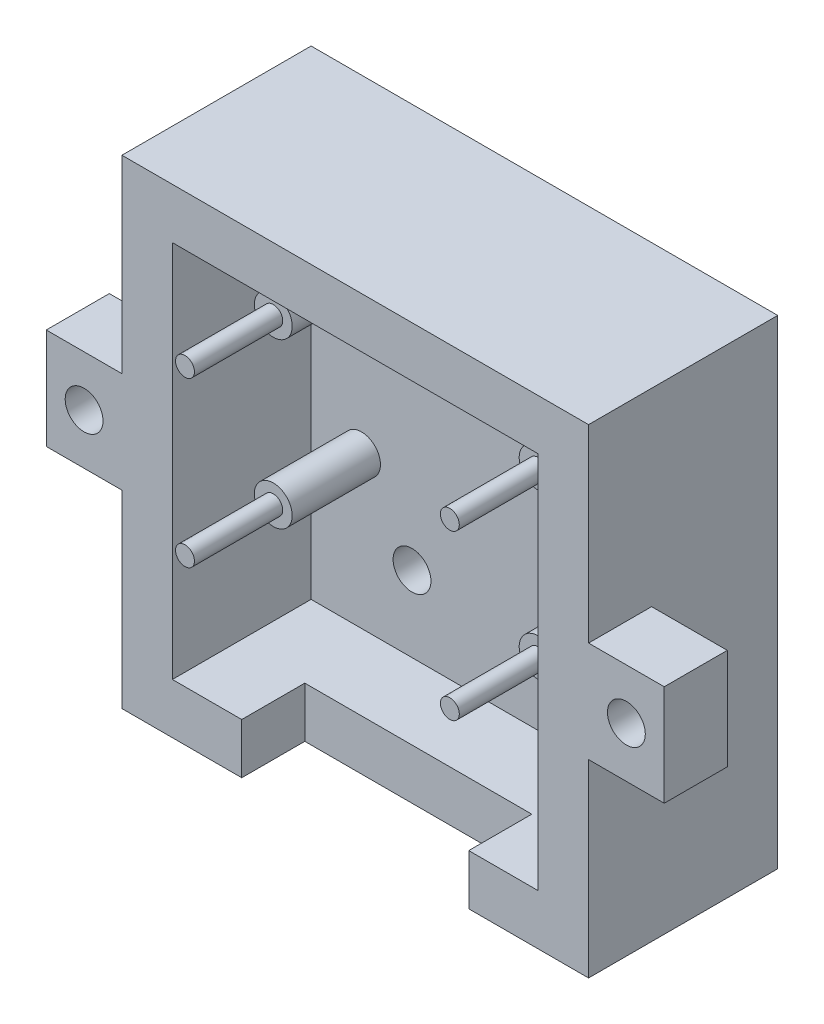
ISO-10303-21;
HEADER;
FILE_DESCRIPTION(('STEP AP214'),'2;1');
FILE_NAME('part.step','',(''),(''),'','','');
FILE_SCHEMA(('AUTOMOTIVE_DESIGN { 1 0 10303 214 1 1 1 1 }'));
ENDSEC;
DATA;
#1=APPLICATION_CONTEXT('core data for automotive mechanical design processes');
#2=APPLICATION_PROTOCOL_DEFINITION('international standard','automotive_design',2000,#1);
#3=PRODUCT_CONTEXT('',#1,'mechanical');
#4=PRODUCT('Part','Part','',(#3));
#5=PRODUCT_RELATED_PRODUCT_CATEGORY('part','',(#4));
#6=PRODUCT_DEFINITION_FORMATION('','',#4);
#7=PRODUCT_DEFINITION_CONTEXT('part definition',#1,'design');
#8=PRODUCT_DEFINITION('design','',#6,#7);
#9=PRODUCT_DEFINITION_SHAPE('','',#8);
#10=(LENGTH_UNIT() NAMED_UNIT(*) SI_UNIT(.MILLI.,.METRE.));
#11=(NAMED_UNIT(*) PLANE_ANGLE_UNIT() SI_UNIT($,.RADIAN.));
#12=(NAMED_UNIT(*) SI_UNIT($,.STERADIAN.) SOLID_ANGLE_UNIT());
#13=UNCERTAINTY_MEASURE_WITH_UNIT(LENGTH_MEASURE(1.E-05),#10,'distance_accuracy_value','');
#14=(GEOMETRIC_REPRESENTATION_CONTEXT(3) GLOBAL_UNCERTAINTY_ASSIGNED_CONTEXT((#13)) GLOBAL_UNIT_ASSIGNED_CONTEXT((#10,
#11,#12)) REPRESENTATION_CONTEXT('',''));
#15=CARTESIAN_POINT('',(0.,0.,0.));
#16=DIRECTION('',(0.,0.,1.));
#17=DIRECTION('',(1.,0.,0.));
#18=AXIS2_PLACEMENT_3D('',#15,#16,#17);
#19=CARTESIAN_POINT('',(-18.5,19.,15.));
#20=DIRECTION('',(1.,0.,0.));
#21=DIRECTION('',(0.,0.,-1.));
#22=AXIS2_PLACEMENT_3D('',#19,#20,#21);
#23=PLANE('',#22);
#24=DIRECTION('',(0.,0.,1.));
#25=VECTOR('',#24,1.);
#26=CARTESIAN_POINT('',(-18.5,-4.,10.));
#27=LINE('',#26,#25);
#28=CARTESIAN_POINT('',(-18.5,-4.,10.));
#29=VERTEX_POINT('',#28);
#30=CARTESIAN_POINT('',(-18.5,-4.,15.));
#31=VERTEX_POINT('',#30);
#32=EDGE_CURVE('E231',#29,#31,#27,.T.);
#33=ORIENTED_EDGE('',*,*,#32,.F.);
#34=DIRECTION('',(0.,1.,0.));
#35=VECTOR('',#34,1.);
#36=CARTESIAN_POINT('',(-18.5,0.,10.));
#37=LINE('',#36,#35);
#38=CARTESIAN_POINT('',(-18.5,4.,10.));
#39=VERTEX_POINT('',#38);
#40=EDGE_CURVE('E222',#29,#39,#37,.T.);
#41=ORIENTED_EDGE('',*,*,#40,.T.);
#42=DIRECTION('',(0.,0.,1.));
#43=VECTOR('',#42,1.);
#44=CARTESIAN_POINT('',(-18.5,4.,10.));
#45=LINE('',#44,#43);
#46=CARTESIAN_POINT('',(-18.5,4.,15.));
#47=VERTEX_POINT('',#46);
#48=EDGE_CURVE('E245',#39,#47,#45,.T.);
#49=ORIENTED_EDGE('',*,*,#48,.T.);
#50=DIRECTION('',(0.,-1.,0.));
#51=VECTOR('',#50,1.);
#52=CARTESIAN_POINT('',(-18.5,19.,15.));
#53=LINE('',#52,#51);
#54=CARTESIAN_POINT('',(-18.5,19.,15.));
#55=VERTEX_POINT('',#54);
#56=EDGE_CURVE('E311',#55,#47,#53,.T.);
#57=ORIENTED_EDGE('',*,*,#56,.F.);
#58=DIRECTION('',(0.,0.,-1.));
#59=VECTOR('',#58,1.);
#60=CARTESIAN_POINT('',(-18.5,19.,15.));
#61=LINE('',#60,#59);
#62=CARTESIAN_POINT('',(-18.5,19.,0.));
#63=VERTEX_POINT('',#62);
#64=EDGE_CURVE('E324',#55,#63,#61,.T.);
#65=ORIENTED_EDGE('',*,*,#64,.T.);
#66=DIRECTION('',(0.,-1.,0.));
#67=VECTOR('',#66,1.);
#68=CARTESIAN_POINT('',(-18.5,19.,0.));
#69=LINE('',#68,#67);
#70=CARTESIAN_POINT('',(-18.5,-19.,0.));
#71=VERTEX_POINT('',#70);
#72=EDGE_CURVE('E285',#63,#71,#69,.T.);
#73=ORIENTED_EDGE('',*,*,#72,.T.);
#74=DIRECTION('',(0.,0.,-1.));
#75=VECTOR('',#74,1.);
#76=CARTESIAN_POINT('',(-18.5,-19.,15.));
#77=LINE('',#76,#75);
#78=CARTESIAN_POINT('',(-18.5,-19.,15.));
#79=VERTEX_POINT('',#78);
#80=EDGE_CURVE('E341',#79,#71,#77,.T.);
#81=ORIENTED_EDGE('',*,*,#80,.F.);
#82=EDGE_CURVE('E315',#31,#79,#53,.T.);
#83=ORIENTED_EDGE('',*,*,#82,.F.);
#84=EDGE_LOOP('',(#33,#41,#49,#57,#65,#73,#81,#83));
#85=FACE_BOUND('',#84,.T.);
#86=ADVANCED_FACE('F45',(#85),#23,.F.);
#87=CARTESIAN_POINT('',(18.5,19.,15.));
#88=DIRECTION('',(-1.,0.,0.));
#89=DIRECTION('',(0.,0.,1.));
#90=AXIS2_PLACEMENT_3D('',#87,#88,#89);
#91=PLANE('',#90);
#92=DIRECTION('',(0.,0.,1.));
#93=VECTOR('',#92,1.);
#94=CARTESIAN_POINT('',(18.5,4.,10.));
#95=LINE('',#94,#93);
#96=CARTESIAN_POINT('',(18.5,4.,10.));
#97=VERTEX_POINT('',#96);
#98=CARTESIAN_POINT('',(18.5,4.,15.));
#99=VERTEX_POINT('',#98);
#100=EDGE_CURVE('E272',#97,#99,#95,.T.);
#101=ORIENTED_EDGE('',*,*,#100,.F.);
#102=DIRECTION('',(0.,1.,0.));
#103=VECTOR('',#102,1.);
#104=CARTESIAN_POINT('',(18.5,0.,10.));
#105=LINE('',#104,#103);
#106=CARTESIAN_POINT('',(18.5,-4.,10.));
#107=VERTEX_POINT('',#106);
#108=EDGE_CURVE('E258',#107,#97,#105,.T.);
#109=ORIENTED_EDGE('',*,*,#108,.F.);
#110=DIRECTION('',(0.,0.,1.));
#111=VECTOR('',#110,1.);
#112=CARTESIAN_POINT('',(18.5,-4.,10.));
#113=LINE('',#112,#111);
#114=CARTESIAN_POINT('',(18.5,-4.,15.));
#115=VERTEX_POINT('',#114);
#116=EDGE_CURVE('E268',#107,#115,#113,.T.);
#117=ORIENTED_EDGE('',*,*,#116,.T.);
#118=DIRECTION('',(0.,1.,0.));
#119=VECTOR('',#118,1.);
#120=CARTESIAN_POINT('',(18.5,19.,15.));
#121=LINE('',#120,#119);
#122=CARTESIAN_POINT('',(18.5,-19.,15.));
#123=VERTEX_POINT('',#122);
#124=EDGE_CURVE('E319',#123,#115,#121,.T.);
#125=ORIENTED_EDGE('',*,*,#124,.F.);
#126=DIRECTION('',(0.,0.,-1.));
#127=VECTOR('',#126,1.);
#128=CARTESIAN_POINT('',(18.5,-19.,15.));
#129=LINE('',#128,#127);
#130=CARTESIAN_POINT('',(18.5,-19.,0.));
#131=VERTEX_POINT('',#130);
#132=EDGE_CURVE('E338',#123,#131,#129,.T.);
#133=ORIENTED_EDGE('',*,*,#132,.T.);
#134=DIRECTION('',(0.,1.,0.));
#135=VECTOR('',#134,1.);
#136=CARTESIAN_POINT('',(18.5,19.,0.));
#137=LINE('',#136,#135);
#138=CARTESIAN_POINT('',(18.5,19.,0.));
#139=VERTEX_POINT('',#138);
#140=EDGE_CURVE('E329',#131,#139,#137,.T.);
#141=ORIENTED_EDGE('',*,*,#140,.T.);
#142=DIRECTION('',(0.,0.,-1.));
#143=VECTOR('',#142,1.);
#144=CARTESIAN_POINT('',(18.5,19.,15.));
#145=LINE('',#144,#143);
#146=CARTESIAN_POINT('',(18.5,19.,15.));
#147=VERTEX_POINT('',#146);
#148=EDGE_CURVE('E335',#147,#139,#145,.T.);
#149=ORIENTED_EDGE('',*,*,#148,.F.);
#150=EDGE_CURVE('E318',#99,#147,#121,.T.);
#151=ORIENTED_EDGE('',*,*,#150,.F.);
#152=EDGE_LOOP('',(#101,#109,#117,#125,#133,#141,#149,#151));
#153=FACE_BOUND('',#152,.T.);
#154=ADVANCED_FACE('F420',(#153),#91,.F.);
#155=CARTESIAN_POINT('',(-18.5,-19.,15.));
#156=DIRECTION('',(0.,1.,0.));
#157=DIRECTION('',(0.,0.,1.));
#158=AXIS2_PLACEMENT_3D('',#155,#156,#157);
#159=PLANE('',#158);
#160=DIRECTION('',(1.,0.,0.));
#161=VECTOR('',#160,1.);
#162=CARTESIAN_POINT('',(-9.,-19.,10.));
#163=LINE('',#162,#161);
#164=CARTESIAN_POINT('',(-9.,-19.,10.));
#165=VERTEX_POINT('',#164);
#166=CARTESIAN_POINT('',(9.,-19.,10.));
#167=VERTEX_POINT('',#166);
#168=EDGE_CURVE('E185',#165,#167,#163,.T.);
#169=ORIENTED_EDGE('',*,*,#168,.F.);
#170=DIRECTION('',(0.,0.,-1.));
#171=VECTOR('',#170,1.);
#172=CARTESIAN_POINT('',(-9.,-19.,15.));
#173=LINE('',#172,#171);
#174=CARTESIAN_POINT('',(-9.,-19.,15.));
#175=VERTEX_POINT('',#174);
#176=EDGE_CURVE('E194',#175,#165,#173,.T.);
#177=ORIENTED_EDGE('',*,*,#176,.F.);
#178=DIRECTION('',(1.,0.,0.));
#179=VECTOR('',#178,1.);
#180=CARTESIAN_POINT('',(-18.5,-19.,15.));
#181=LINE('',#180,#179);
#182=EDGE_CURVE('E316',#79,#175,#181,.T.);
#183=ORIENTED_EDGE('',*,*,#182,.F.);
#184=ORIENTED_EDGE('',*,*,#80,.T.);
#185=DIRECTION('',(1.,0.,0.));
#186=VECTOR('',#185,1.);
#187=CARTESIAN_POINT('',(-18.5,-19.,0.));
#188=LINE('',#187,#186);
#189=EDGE_CURVE('E327',#71,#131,#188,.T.);
#190=ORIENTED_EDGE('',*,*,#189,.T.);
#191=ORIENTED_EDGE('',*,*,#132,.F.);
#192=CARTESIAN_POINT('',(9.,-19.,15.));
#193=VERTEX_POINT('',#192);
#194=EDGE_CURVE('E314',#193,#123,#181,.T.);
#195=ORIENTED_EDGE('',*,*,#194,.F.);
#196=DIRECTION('',(0.,0.,1.));
#197=VECTOR('',#196,1.);
#198=CARTESIAN_POINT('',(9.,-19.,15.));
#199=LINE('',#198,#197);
#200=EDGE_CURVE('E191',#167,#193,#199,.T.);
#201=ORIENTED_EDGE('',*,*,#200,.F.);
#202=EDGE_LOOP('',(#169,#177,#183,#184,#190,#191,#195,#201));
#203=FACE_BOUND('',#202,.T.);
#204=ADVANCED_FACE('F203',(#203),#159,.F.);
#205=CARTESIAN_POINT('',(-18.5,19.,15.));
#206=DIRECTION('',(0.,-1.,0.));
#207=DIRECTION('',(0.,0.,-1.));
#208=AXIS2_PLACEMENT_3D('',#205,#206,#207);
#209=PLANE('',#208);
#210=DIRECTION('',(-1.,0.,0.));
#211=VECTOR('',#210,1.);
#212=CARTESIAN_POINT('',(-18.5,19.,0.));
#213=LINE('',#212,#211);
#214=EDGE_CURVE('E331',#139,#63,#213,.T.);
#215=ORIENTED_EDGE('',*,*,#214,.T.);
#216=ORIENTED_EDGE('',*,*,#64,.F.);
#217=DIRECTION('',(-1.,0.,0.));
#218=VECTOR('',#217,1.);
#219=CARTESIAN_POINT('',(-18.5,19.,15.));
#220=LINE('',#219,#218);
#221=EDGE_CURVE('E322',#147,#55,#220,.T.);
#222=ORIENTED_EDGE('',*,*,#221,.F.);
#223=ORIENTED_EDGE('',*,*,#148,.T.);
#224=EDGE_LOOP('',(#215,#216,#222,#223));
#225=FACE_BOUND('',#224,.T.);
#226=ADVANCED_FACE('F451',(#225),#209,.F.);
#227=CARTESIAN_POINT('',(0.,0.,15.));
#228=DIRECTION('',(0.,0.,1.));
#229=DIRECTION('',(1.,0.,0.));
#230=AXIS2_PLACEMENT_3D('',#227,#228,#229);
#231=PLANE('',#230);
#232=DIRECTION('',(0.,-1.,0.));
#233=VECTOR('',#232,1.);
#234=CARTESIAN_POINT('',(-9.,-14.,15.));
#235=LINE('',#234,#233);
#236=CARTESIAN_POINT('',(-9.,-15.,15.));
#237=VERTEX_POINT('',#236);
#238=EDGE_CURVE('E197',#237,#175,#235,.T.);
#239=ORIENTED_EDGE('',*,*,#238,.F.);
#240=DIRECTION('',(1.,0.,0.));
#241=VECTOR('',#240,1.);
#242=CARTESIAN_POINT('',(-18.5,-15.,15.));
#243=LINE('',#242,#241);
#244=CARTESIAN_POINT('',(-14.5,-15.,15.));
#245=VERTEX_POINT('',#244);
#246=EDGE_CURVE('E304',#245,#237,#243,.T.);
#247=ORIENTED_EDGE('',*,*,#246,.F.);
#248=DIRECTION('',(0.,-1.,0.));
#249=VECTOR('',#248,1.);
#250=CARTESIAN_POINT('',(-14.5,19.,15.));
#251=LINE('',#250,#249);
#252=CARTESIAN_POINT('',(-14.5,15.,15.));
#253=VERTEX_POINT('',#252);
#254=EDGE_CURVE('E301',#253,#245,#251,.T.);
#255=ORIENTED_EDGE('',*,*,#254,.F.);
#256=DIRECTION('',(-1.,0.,0.));
#257=VECTOR('',#256,1.);
#258=CARTESIAN_POINT('',(-18.5,15.,15.));
#259=LINE('',#258,#257);
#260=CARTESIAN_POINT('',(14.5,15.,15.));
#261=VERTEX_POINT('',#260);
#262=EDGE_CURVE('E291',#261,#253,#259,.T.);
#263=ORIENTED_EDGE('',*,*,#262,.F.);
#264=DIRECTION('',(0.,1.,0.));
#265=VECTOR('',#264,1.);
#266=CARTESIAN_POINT('',(14.5,19.,15.));
#267=LINE('',#266,#265);
#268=CARTESIAN_POINT('',(14.5,-15.,15.));
#269=VERTEX_POINT('',#268);
#270=EDGE_CURVE('E307',#269,#261,#267,.T.);
#271=ORIENTED_EDGE('',*,*,#270,.F.);
#272=CARTESIAN_POINT('',(9.,-15.,15.));
#273=VERTEX_POINT('',#272);
#274=EDGE_CURVE('E303',#273,#269,#243,.T.);
#275=ORIENTED_EDGE('',*,*,#274,.F.);
#276=DIRECTION('',(0.,-1.,0.));
#277=VECTOR('',#276,1.);
#278=CARTESIAN_POINT('',(9.,-14.,15.));
#279=LINE('',#278,#277);
#280=EDGE_CURVE('E211',#273,#193,#279,.T.);
#281=ORIENTED_EDGE('',*,*,#280,.T.);
#282=ORIENTED_EDGE('',*,*,#194,.T.);
#283=ORIENTED_EDGE('',*,*,#124,.T.);
#284=DIRECTION('',(-1.,0.,0.));
#285=VECTOR('',#284,1.);
#286=CARTESIAN_POINT('',(0.,-4.,15.));
#287=LINE('',#286,#285);
#288=CARTESIAN_POINT('',(24.5,-4.,15.));
#289=VERTEX_POINT('',#288);
#290=EDGE_CURVE('E263',#289,#115,#287,.T.);
#291=ORIENTED_EDGE('',*,*,#290,.F.);
#292=DIRECTION('',(0.,-1.,0.));
#293=VECTOR('',#292,1.);
#294=CARTESIAN_POINT('',(24.5,0.,15.));
#295=LINE('',#294,#293);
#296=CARTESIAN_POINT('',(24.5,4.,15.));
#297=VERTEX_POINT('',#296);
#298=EDGE_CURVE('E265',#297,#289,#295,.T.);
#299=ORIENTED_EDGE('',*,*,#298,.F.);
#300=DIRECTION('',(1.,0.,0.));
#301=VECTOR('',#300,1.);
#302=CARTESIAN_POINT('',(0.,4.,15.));
#303=LINE('',#302,#301);
#304=EDGE_CURVE('E252',#99,#297,#303,.T.);
#305=ORIENTED_EDGE('',*,*,#304,.F.);
#306=ORIENTED_EDGE('',*,*,#150,.T.);
#307=ORIENTED_EDGE('',*,*,#221,.T.);
#308=ORIENTED_EDGE('',*,*,#56,.T.);
#309=DIRECTION('',(-1.,0.,0.));
#310=VECTOR('',#309,1.);
#311=CARTESIAN_POINT('',(0.,4.,15.));
#312=LINE('',#311,#310);
#313=CARTESIAN_POINT('',(-24.5,4.,15.));
#314=VERTEX_POINT('',#313);
#315=EDGE_CURVE('E69',#47,#314,#312,.T.);
#316=ORIENTED_EDGE('',*,*,#315,.T.);
#317=DIRECTION('',(0.,-1.,0.));
#318=VECTOR('',#317,1.);
#319=CARTESIAN_POINT('',(-24.5,0.,15.));
#320=LINE('',#319,#318);
#321=CARTESIAN_POINT('',(-24.5,-4.,15.));
#322=VERTEX_POINT('',#321);
#323=EDGE_CURVE('E219',#314,#322,#320,.T.);
#324=ORIENTED_EDGE('',*,*,#323,.T.);
#325=DIRECTION('',(1.,0.,0.));
#326=VECTOR('',#325,1.);
#327=CARTESIAN_POINT('',(0.,-4.,15.));
#328=LINE('',#327,#326);
#329=EDGE_CURVE('E234',#322,#31,#328,.T.);
#330=ORIENTED_EDGE('',*,*,#329,.T.);
#331=ORIENTED_EDGE('',*,*,#82,.T.);
#332=ORIENTED_EDGE('',*,*,#182,.T.);
#333=EDGE_LOOP('',(#239,#247,#255,#263,#271,#275,#281,#282,#283,#291,#299,#305,#306,#307,#308,
#316,#324,#330,#331,#332));
#334=FACE_BOUND('',#333,.T.);
#335=CARTESIAN_POINT('',(21.5,0.,15.));
#336=DIRECTION('',(0.,0.,1.));
#337=DIRECTION('',(1.,0.,0.));
#338=AXIS2_PLACEMENT_3D('',#335,#336,#337);
#339=CIRCLE('',#338,1.5);
#340=CARTESIAN_POINT('',(23.,0.,15.));
#341=VERTEX_POINT('',#340);
#342=EDGE_CURVE('E242',#341,#341,#339,.T.);
#343=ORIENTED_EDGE('',*,*,#342,.F.);
#344=EDGE_LOOP('',(#343));
#345=FACE_BOUND('',#344,.T.);
#346=CARTESIAN_POINT('',(-21.5,0.,15.));
#347=DIRECTION('',(0.,0.,-1.));
#348=DIRECTION('',(-1.,0.,0.));
#349=AXIS2_PLACEMENT_3D('',#346,#347,#348);
#350=CIRCLE('',#349,1.5);
#351=CARTESIAN_POINT('',(-23.,0.,15.));
#352=VERTEX_POINT('',#351);
#353=EDGE_CURVE('E210',#352,#352,#350,.T.);
#354=ORIENTED_EDGE('',*,*,#353,.T.);
#355=EDGE_LOOP('',(#354));
#356=FACE_BOUND('',#355,.T.);
#357=ADVANCED_FACE('F402',(#334,#345,#356),#231,.T.);
#358=CARTESIAN_POINT('',(0.,0.,0.));
#359=DIRECTION('',(0.,0.,1.));
#360=DIRECTION('',(1.,0.,0.));
#361=AXIS2_PLACEMENT_3D('',#358,#359,#360);
#362=PLANE('',#361);
#363=CARTESIAN_POINT('',(-6.5,-9.,0.));
#364=DIRECTION('',(0.,0.,1.));
#365=DIRECTION('',(1.,0.,0.));
#366=AXIS2_PLACEMENT_3D('',#363,#364,#365);
#367=CIRCLE('',#366,1.5);
#368=CARTESIAN_POINT('',(-5.,-9.,0.));
#369=VERTEX_POINT('',#368);
#370=EDGE_CURVE('E876',#369,#369,#367,.T.);
#371=ORIENTED_EDGE('',*,*,#370,.T.);
#372=EDGE_LOOP('',(#371));
#373=FACE_BOUND('',#372,.T.);
#374=CARTESIAN_POINT('',(6.5,-9.,0.));
#375=DIRECTION('',(0.,0.,1.));
#376=DIRECTION('',(1.,0.,0.));
#377=AXIS2_PLACEMENT_3D('',#374,#375,#376);
#378=CIRCLE('',#377,1.5);
#379=CARTESIAN_POINT('',(8.,-9.,0.));
#380=VERTEX_POINT('',#379);
#381=EDGE_CURVE('E878',#380,#380,#378,.T.);
#382=ORIENTED_EDGE('',*,*,#381,.T.);
#383=EDGE_LOOP('',(#382));
#384=FACE_BOUND('',#383,.T.);
#385=CARTESIAN_POINT('',(6.5,9.,0.));
#386=DIRECTION('',(0.,0.,1.));
#387=DIRECTION('',(1.,0.,0.));
#388=AXIS2_PLACEMENT_3D('',#385,#386,#387);
#389=CIRCLE('',#388,1.5);
#390=CARTESIAN_POINT('',(8.,9.,0.));
#391=VERTEX_POINT('',#390);
#392=EDGE_CURVE('E884',#391,#391,#389,.T.);
#393=ORIENTED_EDGE('',*,*,#392,.T.);
#394=EDGE_LOOP('',(#393));
#395=FACE_BOUND('',#394,.T.);
#396=CARTESIAN_POINT('',(-6.5,9.,0.));
#397=DIRECTION('',(0.,0.,1.));
#398=DIRECTION('',(1.,0.,0.));
#399=AXIS2_PLACEMENT_3D('',#396,#397,#398);
#400=CIRCLE('',#399,1.5);
#401=CARTESIAN_POINT('',(-5.,9.,0.));
#402=VERTEX_POINT('',#401);
#403=EDGE_CURVE('E913',#402,#402,#400,.T.);
#404=ORIENTED_EDGE('',*,*,#403,.T.);
#405=EDGE_LOOP('',(#404));
#406=FACE_BOUND('',#405,.T.);
#407=ORIENTED_EDGE('',*,*,#72,.F.);
#408=ORIENTED_EDGE('',*,*,#214,.F.);
#409=ORIENTED_EDGE('',*,*,#140,.F.);
#410=ORIENTED_EDGE('',*,*,#189,.F.);
#411=EDGE_LOOP('',(#407,#408,#409,#410));
#412=FACE_BOUND('',#411,.T.);
#413=ADVANCED_FACE('F414',(#373,#384,#395,#406,#412),#362,.F.);
#414=CARTESIAN_POINT('',(-14.5,19.,15.));
#415=DIRECTION('',(1.,0.,0.));
#416=DIRECTION('',(0.,0.,-1.));
#417=AXIS2_PLACEMENT_3D('',#414,#415,#416);
#418=PLANE('',#417);
#419=DIRECTION('',(0.,-1.,0.));
#420=VECTOR('',#419,1.);
#421=CARTESIAN_POINT('',(-14.5,19.,4.));
#422=LINE('',#421,#420);
#423=CARTESIAN_POINT('',(-14.5,15.,4.));
#424=VERTEX_POINT('',#423);
#425=CARTESIAN_POINT('',(-14.5,-15.,4.));
#426=VERTEX_POINT('',#425);
#427=EDGE_CURVE('E271',#424,#426,#422,.T.);
#428=ORIENTED_EDGE('',*,*,#427,.F.);
#429=DIRECTION('',(0.,0.,-1.));
#430=VECTOR('',#429,1.);
#431=CARTESIAN_POINT('',(-14.5,15.,15.));
#432=LINE('',#431,#430);
#433=EDGE_CURVE('E287',#253,#424,#432,.T.);
#434=ORIENTED_EDGE('',*,*,#433,.F.);
#435=ORIENTED_EDGE('',*,*,#254,.T.);
#436=DIRECTION('',(0.,0.,-1.));
#437=VECTOR('',#436,1.);
#438=CARTESIAN_POINT('',(-14.5,-15.,15.));
#439=LINE('',#438,#437);
#440=EDGE_CURVE('E282',#245,#426,#439,.T.);
#441=ORIENTED_EDGE('',*,*,#440,.T.);
#442=EDGE_LOOP('',(#428,#434,#435,#441));
#443=FACE_BOUND('',#442,.T.);
#444=ADVANCED_FACE('F395',(#443),#418,.T.);
#445=CARTESIAN_POINT('',(-18.5,-15.,15.));
#446=DIRECTION('',(0.,1.,0.));
#447=DIRECTION('',(0.,0.,1.));
#448=AXIS2_PLACEMENT_3D('',#445,#446,#447);
#449=PLANE('',#448);
#450=DIRECTION('',(0.,0.,1.));
#451=VECTOR('',#450,1.);
#452=CARTESIAN_POINT('',(-9.,-15.,15.));
#453=LINE('',#452,#451);
#454=CARTESIAN_POINT('',(-9.,-15.,10.));
#455=VERTEX_POINT('',#454);
#456=EDGE_CURVE('E48',#455,#237,#453,.T.);
#457=ORIENTED_EDGE('',*,*,#456,.F.);
#458=DIRECTION('',(-1.,0.,0.));
#459=VECTOR('',#458,1.);
#460=CARTESIAN_POINT('',(-18.5,-15.,10.));
#461=LINE('',#460,#459);
#462=CARTESIAN_POINT('',(9.,-15.,10.));
#463=VERTEX_POINT('',#462);
#464=EDGE_CURVE('E188',#463,#455,#461,.T.);
#465=ORIENTED_EDGE('',*,*,#464,.F.);
#466=DIRECTION('',(0.,0.,-1.));
#467=VECTOR('',#466,1.);
#468=CARTESIAN_POINT('',(9.,-15.,15.));
#469=LINE('',#468,#467);
#470=EDGE_CURVE('E344',#273,#463,#469,.T.);
#471=ORIENTED_EDGE('',*,*,#470,.F.);
#472=ORIENTED_EDGE('',*,*,#274,.T.);
#473=DIRECTION('',(0.,0.,-1.));
#474=VECTOR('',#473,1.);
#475=CARTESIAN_POINT('',(14.5,-15.,15.));
#476=LINE('',#475,#474);
#477=CARTESIAN_POINT('',(14.5,-15.,4.));
#478=VERTEX_POINT('',#477);
#479=EDGE_CURVE('E286',#269,#478,#476,.T.);
#480=ORIENTED_EDGE('',*,*,#479,.T.);
#481=DIRECTION('',(1.,0.,0.));
#482=VECTOR('',#481,1.);
#483=CARTESIAN_POINT('',(-18.5,-15.,4.));
#484=LINE('',#483,#482);
#485=EDGE_CURVE('E281',#426,#478,#484,.T.);
#486=ORIENTED_EDGE('',*,*,#485,.F.);
#487=ORIENTED_EDGE('',*,*,#440,.F.);
#488=ORIENTED_EDGE('',*,*,#246,.T.);
#489=EDGE_LOOP('',(#457,#465,#471,#472,#480,#486,#487,#488));
#490=FACE_BOUND('',#489,.T.);
#491=ADVANCED_FACE('F400',(#490),#449,.T.);
#492=CARTESIAN_POINT('',(14.5,19.,15.));
#493=DIRECTION('',(-1.,0.,0.));
#494=DIRECTION('',(0.,0.,1.));
#495=AXIS2_PLACEMENT_3D('',#492,#493,#494);
#496=PLANE('',#495);
#497=DIRECTION('',(0.,1.,0.));
#498=VECTOR('',#497,1.);
#499=CARTESIAN_POINT('',(14.5,19.,4.));
#500=LINE('',#499,#498);
#501=CARTESIAN_POINT('',(14.5,15.,4.));
#502=VERTEX_POINT('',#501);
#503=EDGE_CURVE('E293',#478,#502,#500,.T.);
#504=ORIENTED_EDGE('',*,*,#503,.F.);
#505=ORIENTED_EDGE('',*,*,#479,.F.);
#506=ORIENTED_EDGE('',*,*,#270,.T.);
#507=DIRECTION('',(0.,0.,-1.));
#508=VECTOR('',#507,1.);
#509=CARTESIAN_POINT('',(14.5,15.,15.));
#510=LINE('',#509,#508);
#511=EDGE_CURVE('E290',#261,#502,#510,.T.);
#512=ORIENTED_EDGE('',*,*,#511,.T.);
#513=EDGE_LOOP('',(#504,#505,#506,#512));
#514=FACE_BOUND('',#513,.T.);
#515=ADVANCED_FACE('F432',(#514),#496,.T.);
#516=CARTESIAN_POINT('',(-18.5,15.,15.));
#517=DIRECTION('',(0.,-1.,0.));
#518=DIRECTION('',(0.,0.,-1.));
#519=AXIS2_PLACEMENT_3D('',#516,#517,#518);
#520=PLANE('',#519);
#521=DIRECTION('',(-1.,0.,0.));
#522=VECTOR('',#521,1.);
#523=CARTESIAN_POINT('',(-18.5,15.,4.));
#524=LINE('',#523,#522);
#525=EDGE_CURVE('E297',#502,#424,#524,.T.);
#526=ORIENTED_EDGE('',*,*,#525,.F.);
#527=ORIENTED_EDGE('',*,*,#511,.F.);
#528=ORIENTED_EDGE('',*,*,#262,.T.);
#529=ORIENTED_EDGE('',*,*,#433,.T.);
#530=EDGE_LOOP('',(#526,#527,#528,#529));
#531=FACE_BOUND('',#530,.T.);
#532=ADVANCED_FACE('F388',(#531),#520,.T.);
#533=CARTESIAN_POINT('',(0.,0.,4.));
#534=DIRECTION('',(0.,0.,1.));
#535=DIRECTION('',(1.,0.,0.));
#536=AXIS2_PLACEMENT_3D('',#533,#534,#535);
#537=PLANE('',#536);
#538=CARTESIAN_POINT('',(-6.5,-9.,4.));
#539=DIRECTION('',(0.,0.,1.));
#540=DIRECTION('',(1.,0.,0.));
#541=AXIS2_PLACEMENT_3D('',#538,#539,#540);
#542=CIRCLE('',#541,1.5);
#543=CARTESIAN_POINT('',(-5.,-9.,4.));
#544=VERTEX_POINT('',#543);
#545=EDGE_CURVE('E873',#544,#544,#542,.T.);
#546=ORIENTED_EDGE('',*,*,#545,.F.);
#547=EDGE_LOOP('',(#546));
#548=FACE_BOUND('',#547,.T.);
#549=CARTESIAN_POINT('',(6.5,-9.,4.));
#550=DIRECTION('',(0.,0.,1.));
#551=DIRECTION('',(1.,0.,0.));
#552=AXIS2_PLACEMENT_3D('',#549,#550,#551);
#553=CIRCLE('',#552,1.5);
#554=CARTESIAN_POINT('',(8.,-9.,4.));
#555=VERTEX_POINT('',#554);
#556=EDGE_CURVE('E921',#555,#555,#553,.T.);
#557=ORIENTED_EDGE('',*,*,#556,.F.);
#558=EDGE_LOOP('',(#557));
#559=FACE_BOUND('',#558,.T.);
#560=CARTESIAN_POINT('',(6.5,9.,4.));
#561=DIRECTION('',(0.,0.,1.));
#562=DIRECTION('',(1.,0.,0.));
#563=AXIS2_PLACEMENT_3D('',#560,#561,#562);
#564=CIRCLE('',#563,1.5);
#565=CARTESIAN_POINT('',(8.,9.,4.));
#566=VERTEX_POINT('',#565);
#567=EDGE_CURVE('E919',#566,#566,#564,.T.);
#568=ORIENTED_EDGE('',*,*,#567,.F.);
#569=EDGE_LOOP('',(#568));
#570=FACE_BOUND('',#569,.T.);
#571=CARTESIAN_POINT('',(-6.5,9.,4.));
#572=DIRECTION('',(0.,0.,1.));
#573=DIRECTION('',(1.,0.,0.));
#574=AXIS2_PLACEMENT_3D('',#571,#572,#573);
#575=CIRCLE('',#574,1.5);
#576=CARTESIAN_POINT('',(-5.,9.,4.));
#577=VERTEX_POINT('',#576);
#578=EDGE_CURVE('E916',#577,#577,#575,.T.);
#579=ORIENTED_EDGE('',*,*,#578,.F.);
#580=EDGE_LOOP('',(#579));
#581=FACE_BOUND('',#580,.T.);
#582=CARTESIAN_POINT('',(-10.5,-2.99999999999999,4.));
#583=DIRECTION('',(0.,0.,1.));
#584=DIRECTION('',(1.,0.,0.));
#585=AXIS2_PLACEMENT_3D('',#582,#583,#584);
#586=CIRCLE('',#585,1.5);
#587=CARTESIAN_POINT('',(-9.,-2.99999999999999,4.));
#588=VERTEX_POINT('',#587);
#589=EDGE_CURVE('E359',#588,#588,#586,.T.);
#590=ORIENTED_EDGE('',*,*,#589,.F.);
#591=EDGE_LOOP('',(#590));
#592=FACE_BOUND('',#591,.T.);
#593=CARTESIAN_POINT('',(10.5,-2.99999999999999,4.));
#594=DIRECTION('',(0.,0.,1.));
#595=DIRECTION('',(1.,0.,0.));
#596=AXIS2_PLACEMENT_3D('',#593,#594,#595);
#597=CIRCLE('',#596,1.5);
#598=CARTESIAN_POINT('',(12.,-2.99999999999999,4.));
#599=VERTEX_POINT('',#598);
#600=EDGE_CURVE('E366',#599,#599,#597,.T.);
#601=ORIENTED_EDGE('',*,*,#600,.F.);
#602=EDGE_LOOP('',(#601));
#603=FACE_BOUND('',#602,.T.);
#604=CARTESIAN_POINT('',(10.5,10.,4.));
#605=DIRECTION('',(0.,0.,1.));
#606=DIRECTION('',(1.,0.,0.));
#607=AXIS2_PLACEMENT_3D('',#604,#605,#606);
#608=CIRCLE('',#607,1.5);
#609=CARTESIAN_POINT('',(12.,10.,4.));
#610=VERTEX_POINT('',#609);
#611=EDGE_CURVE('E372',#610,#610,#608,.T.);
#612=ORIENTED_EDGE('',*,*,#611,.F.);
#613=EDGE_LOOP('',(#612));
#614=FACE_BOUND('',#613,.T.);
#615=CARTESIAN_POINT('',(-10.5,10.,4.));
#616=DIRECTION('',(0.,0.,1.));
#617=DIRECTION('',(1.,0.,0.));
#618=AXIS2_PLACEMENT_3D('',#615,#616,#617);
#619=CIRCLE('',#618,1.5);
#620=CARTESIAN_POINT('',(-9.,10.,4.));
#621=VERTEX_POINT('',#620);
#622=EDGE_CURVE('E375',#621,#621,#619,.T.);
#623=ORIENTED_EDGE('',*,*,#622,.F.);
#624=EDGE_LOOP('',(#623));
#625=FACE_BOUND('',#624,.T.);
#626=ORIENTED_EDGE('',*,*,#427,.T.);
#627=ORIENTED_EDGE('',*,*,#485,.T.);
#628=ORIENTED_EDGE('',*,*,#503,.T.);
#629=ORIENTED_EDGE('',*,*,#525,.T.);
#630=EDGE_LOOP('',(#626,#627,#628,#629));
#631=FACE_BOUND('',#630,.T.);
#632=ADVANCED_FACE('F384',(#548,#559,#570,#581,#592,#603,#614,#625,#631),#537,.T.);
#633=CARTESIAN_POINT('',(0.,-4.,10.));
#634=DIRECTION('',(0.,1.,0.));
#635=DIRECTION('',(0.,0.,1.));
#636=AXIS2_PLACEMENT_3D('',#633,#634,#635);
#637=PLANE('',#636);
#638=ORIENTED_EDGE('',*,*,#290,.T.);
#639=ORIENTED_EDGE('',*,*,#116,.F.);
#640=DIRECTION('',(-1.,0.,0.));
#641=VECTOR('',#640,1.);
#642=CARTESIAN_POINT('',(0.,-4.,10.));
#643=LINE('',#642,#641);
#644=CARTESIAN_POINT('',(24.5,-4.,10.));
#645=VERTEX_POINT('',#644);
#646=EDGE_CURVE('E251',#645,#107,#643,.T.);
#647=ORIENTED_EDGE('',*,*,#646,.F.);
#648=DIRECTION('',(0.,0.,1.));
#649=VECTOR('',#648,1.);
#650=CARTESIAN_POINT('',(24.5,-4.,10.));
#651=LINE('',#650,#649);
#652=EDGE_CURVE('E260',#645,#289,#651,.T.);
#653=ORIENTED_EDGE('',*,*,#652,.T.);
#654=EDGE_LOOP('',(#638,#639,#647,#653));
#655=FACE_BOUND('',#654,.T.);
#656=ADVANCED_FACE('F387',(#655),#637,.F.);
#657=CARTESIAN_POINT('',(0.,4.,10.));
#658=DIRECTION('',(0.,-1.,0.));
#659=DIRECTION('',(0.,0.,-1.));
#660=AXIS2_PLACEMENT_3D('',#657,#658,#659);
#661=PLANE('',#660);
#662=ORIENTED_EDGE('',*,*,#304,.T.);
#663=DIRECTION('',(0.,0.,1.));
#664=VECTOR('',#663,1.);
#665=CARTESIAN_POINT('',(24.5,4.,10.));
#666=LINE('',#665,#664);
#667=CARTESIAN_POINT('',(24.5,4.,10.));
#668=VERTEX_POINT('',#667);
#669=EDGE_CURVE('E274',#668,#297,#666,.T.);
#670=ORIENTED_EDGE('',*,*,#669,.F.);
#671=DIRECTION('',(1.,0.,0.));
#672=VECTOR('',#671,1.);
#673=CARTESIAN_POINT('',(0.,4.,10.));
#674=LINE('',#673,#672);
#675=EDGE_CURVE('E256',#97,#668,#674,.T.);
#676=ORIENTED_EDGE('',*,*,#675,.F.);
#677=ORIENTED_EDGE('',*,*,#100,.T.);
#678=EDGE_LOOP('',(#662,#670,#676,#677));
#679=FACE_BOUND('',#678,.T.);
#680=ADVANCED_FACE('F781',(#679),#661,.F.);
#681=CARTESIAN_POINT('',(21.5,0.,10.));
#682=DIRECTION('',(0.,0.,1.));
#683=DIRECTION('',(1.,0.,0.));
#684=AXIS2_PLACEMENT_3D('',#681,#682,#683);
#685=CYLINDRICAL_SURFACE('',#684,1.5);
#686=CARTESIAN_POINT('',(21.5,0.,10.));
#687=DIRECTION('',(0.,0.,1.));
#688=DIRECTION('',(1.,0.,0.));
#689=AXIS2_PLACEMENT_3D('',#686,#687,#688);
#690=CIRCLE('',#689,1.5);
#691=CARTESIAN_POINT('',(23.,0.,10.));
#692=VERTEX_POINT('',#691);
#693=EDGE_CURVE('E248',#692,#692,#690,.T.);
#694=ORIENTED_EDGE('',*,*,#693,.F.);
#695=EDGE_LOOP('',(#694));
#696=FACE_BOUND('',#695,.T.);
#697=ORIENTED_EDGE('',*,*,#342,.T.);
#698=EDGE_LOOP('',(#697));
#699=FACE_BOUND('',#698,.T.);
#700=ADVANCED_FACE('F772',(#696,#699),#685,.F.);
#701=CARTESIAN_POINT('',(24.5,0.,10.));
#702=DIRECTION('',(-1.,0.,0.));
#703=DIRECTION('',(0.,0.,1.));
#704=AXIS2_PLACEMENT_3D('',#701,#702,#703);
#705=PLANE('',#704);
#706=ORIENTED_EDGE('',*,*,#298,.T.);
#707=ORIENTED_EDGE('',*,*,#652,.F.);
#708=DIRECTION('',(0.,-1.,0.));
#709=VECTOR('',#708,1.);
#710=CARTESIAN_POINT('',(24.5,0.,10.));
#711=LINE('',#710,#709);
#712=EDGE_CURVE('E254',#668,#645,#711,.T.);
#713=ORIENTED_EDGE('',*,*,#712,.F.);
#714=ORIENTED_EDGE('',*,*,#669,.T.);
#715=EDGE_LOOP('',(#706,#707,#713,#714));
#716=FACE_BOUND('',#715,.T.);
#717=ADVANCED_FACE('F763',(#716),#705,.F.);
#718=CARTESIAN_POINT('',(0.,0.,10.));
#719=DIRECTION('',(0.,0.,1.));
#720=DIRECTION('',(1.,0.,0.));
#721=AXIS2_PLACEMENT_3D('',#718,#719,#720);
#722=PLANE('',#721);
#723=ORIENTED_EDGE('',*,*,#693,.T.);
#724=EDGE_LOOP('',(#723));
#725=FACE_BOUND('',#724,.T.);
#726=ORIENTED_EDGE('',*,*,#646,.T.);
#727=ORIENTED_EDGE('',*,*,#108,.T.);
#728=ORIENTED_EDGE('',*,*,#675,.T.);
#729=ORIENTED_EDGE('',*,*,#712,.T.);
#730=EDGE_LOOP('',(#726,#727,#728,#729));
#731=FACE_BOUND('',#730,.T.);
#732=ADVANCED_FACE('F751',(#725,#731),#722,.F.);
#733=CARTESIAN_POINT('',(0.,-4.,10.));
#734=DIRECTION('',(0.,-1.,0.));
#735=DIRECTION('',(0.,0.,-1.));
#736=AXIS2_PLACEMENT_3D('',#733,#734,#735);
#737=PLANE('',#736);
#738=ORIENTED_EDGE('',*,*,#329,.F.);
#739=DIRECTION('',(0.,0.,1.));
#740=VECTOR('',#739,1.);
#741=CARTESIAN_POINT('',(-24.5,-4.,10.));
#742=LINE('',#741,#740);
#743=CARTESIAN_POINT('',(-24.5,-4.,10.));
#744=VERTEX_POINT('',#743);
#745=EDGE_CURVE('E240',#744,#322,#742,.T.);
#746=ORIENTED_EDGE('',*,*,#745,.F.);
#747=DIRECTION('',(1.,0.,0.));
#748=VECTOR('',#747,1.);
#749=CARTESIAN_POINT('',(0.,-4.,10.));
#750=LINE('',#749,#748);
#751=EDGE_CURVE('E218',#744,#29,#750,.T.);
#752=ORIENTED_EDGE('',*,*,#751,.T.);
#753=ORIENTED_EDGE('',*,*,#32,.T.);
#754=EDGE_LOOP('',(#738,#746,#752,#753));
#755=FACE_BOUND('',#754,.T.);
#756=ADVANCED_FACE('F745',(#755),#737,.T.);
#757=CARTESIAN_POINT('',(-24.5,0.,10.));
#758=DIRECTION('',(-1.,0.,0.));
#759=DIRECTION('',(0.,0.,1.));
#760=AXIS2_PLACEMENT_3D('',#757,#758,#759);
#761=PLANE('',#760);
#762=ORIENTED_EDGE('',*,*,#323,.F.);
#763=DIRECTION('',(0.,0.,1.));
#764=VECTOR('',#763,1.);
#765=CARTESIAN_POINT('',(-24.5,4.,10.));
#766=LINE('',#765,#764);
#767=CARTESIAN_POINT('',(-24.5,4.,10.));
#768=VERTEX_POINT('',#767);
#769=EDGE_CURVE('E243',#768,#314,#766,.T.);
#770=ORIENTED_EDGE('',*,*,#769,.F.);
#771=DIRECTION('',(0.,-1.,0.));
#772=VECTOR('',#771,1.);
#773=CARTESIAN_POINT('',(-24.5,0.,10.));
#774=LINE('',#773,#772);
#775=EDGE_CURVE('E228',#768,#744,#774,.T.);
#776=ORIENTED_EDGE('',*,*,#775,.T.);
#777=ORIENTED_EDGE('',*,*,#745,.T.);
#778=EDGE_LOOP('',(#762,#770,#776,#777));
#779=FACE_BOUND('',#778,.T.);
#780=ADVANCED_FACE('F737',(#779),#761,.T.);
#781=CARTESIAN_POINT('',(0.,4.,10.));
#782=DIRECTION('',(0.,1.,0.));
#783=DIRECTION('',(0.,0.,1.));
#784=AXIS2_PLACEMENT_3D('',#781,#782,#783);
#785=PLANE('',#784);
#786=ORIENTED_EDGE('',*,*,#315,.F.);
#787=ORIENTED_EDGE('',*,*,#48,.F.);
#788=DIRECTION('',(-1.,0.,0.));
#789=VECTOR('',#788,1.);
#790=CARTESIAN_POINT('',(0.,4.,10.));
#791=LINE('',#790,#789);
#792=EDGE_CURVE('E225',#39,#768,#791,.T.);
#793=ORIENTED_EDGE('',*,*,#792,.T.);
#794=ORIENTED_EDGE('',*,*,#769,.T.);
#795=EDGE_LOOP('',(#786,#787,#793,#794));
#796=FACE_BOUND('',#795,.T.);
#797=ADVANCED_FACE('F728',(#796),#785,.T.);
#798=CARTESIAN_POINT('',(-21.5,0.,10.));
#799=DIRECTION('',(0.,0.,1.));
#800=DIRECTION('',(1.,0.,0.));
#801=AXIS2_PLACEMENT_3D('',#798,#799,#800);
#802=CYLINDRICAL_SURFACE('',#801,1.5);
#803=CARTESIAN_POINT('',(-21.5,0.,10.));
#804=DIRECTION('',(0.,0.,-1.));
#805=DIRECTION('',(-1.,0.,0.));
#806=AXIS2_PLACEMENT_3D('',#803,#804,#805);
#807=CIRCLE('',#806,1.5);
#808=CARTESIAN_POINT('',(-23.,0.,10.));
#809=VERTEX_POINT('',#808);
#810=EDGE_CURVE('E215',#809,#809,#807,.T.);
#811=ORIENTED_EDGE('',*,*,#810,.T.);
#812=EDGE_LOOP('',(#811));
#813=FACE_BOUND('',#812,.T.);
#814=ORIENTED_EDGE('',*,*,#353,.F.);
#815=EDGE_LOOP('',(#814));
#816=FACE_BOUND('',#815,.T.);
#817=ADVANCED_FACE('F719',(#813,#816),#802,.F.);
#818=CARTESIAN_POINT('',(0.,0.,10.));
#819=DIRECTION('',(0.,0.,1.));
#820=DIRECTION('',(-1.,0.,0.));
#821=AXIS2_PLACEMENT_3D('',#818,#819,#820);
#822=PLANE('',#821);
#823=ORIENTED_EDGE('',*,*,#810,.F.);
#824=EDGE_LOOP('',(#823));
#825=FACE_BOUND('',#824,.T.);
#826=ORIENTED_EDGE('',*,*,#751,.F.);
#827=ORIENTED_EDGE('',*,*,#775,.F.);
#828=ORIENTED_EDGE('',*,*,#792,.F.);
#829=ORIENTED_EDGE('',*,*,#40,.F.);
#830=EDGE_LOOP('',(#826,#827,#828,#829));
#831=FACE_BOUND('',#830,.T.);
#832=ADVANCED_FACE('F483',(#825,#831),#822,.F.);
#833=CARTESIAN_POINT('',(-9.,-14.,15.));
#834=DIRECTION('',(-1.,0.,0.));
#835=DIRECTION('',(0.,0.,1.));
#836=AXIS2_PLACEMENT_3D('',#833,#834,#835);
#837=PLANE('',#836);
#838=ORIENTED_EDGE('',*,*,#456,.T.);
#839=ORIENTED_EDGE('',*,*,#238,.T.);
#840=ORIENTED_EDGE('',*,*,#176,.T.);
#841=DIRECTION('',(0.,-1.,0.));
#842=VECTOR('',#841,1.);
#843=CARTESIAN_POINT('',(-9.,-14.,10.));
#844=LINE('',#843,#842);
#845=EDGE_CURVE('E181',#455,#165,#844,.T.);
#846=ORIENTED_EDGE('',*,*,#845,.F.);
#847=EDGE_LOOP('',(#838,#839,#840,#846));
#848=FACE_BOUND('',#847,.T.);
#849=ADVANCED_FACE('F195',(#848),#837,.F.);
#850=CARTESIAN_POINT('',(9.,-14.,15.));
#851=DIRECTION('',(1.,0.,0.));
#852=DIRECTION('',(0.,0.,-1.));
#853=AXIS2_PLACEMENT_3D('',#850,#851,#852);
#854=PLANE('',#853);
#855=ORIENTED_EDGE('',*,*,#470,.T.);
#856=DIRECTION('',(0.,-1.,0.));
#857=VECTOR('',#856,1.);
#858=CARTESIAN_POINT('',(9.,-14.,10.));
#859=LINE('',#858,#857);
#860=EDGE_CURVE('E61',#463,#167,#859,.T.);
#861=ORIENTED_EDGE('',*,*,#860,.T.);
#862=ORIENTED_EDGE('',*,*,#200,.T.);
#863=ORIENTED_EDGE('',*,*,#280,.F.);
#864=EDGE_LOOP('',(#855,#861,#862,#863));
#865=FACE_BOUND('',#864,.T.);
#866=ADVANCED_FACE('F428',(#865),#854,.F.);
#867=CARTESIAN_POINT('',(-9.,-14.,10.));
#868=DIRECTION('',(0.,0.,-1.));
#869=DIRECTION('',(-1.,0.,0.));
#870=AXIS2_PLACEMENT_3D('',#867,#868,#869);
#871=PLANE('',#870);
#872=ORIENTED_EDGE('',*,*,#464,.T.);
#873=ORIENTED_EDGE('',*,*,#845,.T.);
#874=ORIENTED_EDGE('',*,*,#168,.T.);
#875=ORIENTED_EDGE('',*,*,#860,.F.);
#876=EDGE_LOOP('',(#872,#873,#874,#875));
#877=FACE_BOUND('',#876,.T.);
#878=ADVANCED_FACE('F183',(#877),#871,.F.);
#879=CARTESIAN_POINT('',(-10.5,10.,11.));
#880=DIRECTION('',(0.,0.,-1.));
#881=DIRECTION('',(-1.,0.,0.));
#882=AXIS2_PLACEMENT_3D('',#879,#880,#881);
#883=CYLINDRICAL_SURFACE('',#882,1.5);
#884=CARTESIAN_POINT('',(-10.5,10.,11.));
#885=DIRECTION('',(0.,0.,1.));
#886=DIRECTION('',(1.,0.,0.));
#887=AXIS2_PLACEMENT_3D('',#884,#885,#886);
#888=CIRCLE('',#887,1.5);
#889=CARTESIAN_POINT('',(-9.,10.,11.));
#890=VERTEX_POINT('',#889);
#891=EDGE_CURVE('E201',#890,#890,#888,.T.);
#892=ORIENTED_EDGE('',*,*,#891,.F.);
#893=EDGE_LOOP('',(#892));
#894=FACE_BOUND('',#893,.T.);
#895=ORIENTED_EDGE('',*,*,#622,.T.);
#896=EDGE_LOOP('',(#895));
#897=FACE_BOUND('',#896,.T.);
#898=ADVANCED_FACE('F382',(#894,#897),#883,.T.);
#899=CARTESIAN_POINT('',(0.,0.,11.));
#900=DIRECTION('',(0.,0.,1.));
#901=DIRECTION('',(1.,0.,0.));
#902=AXIS2_PLACEMENT_3D('',#899,#900,#901);
#903=PLANE('',#902);
#904=CARTESIAN_POINT('',(-10.5,10.,11.));
#905=DIRECTION('',(0.,0.,1.));
#906=DIRECTION('',(1.,0.,0.));
#907=AXIS2_PLACEMENT_3D('',#904,#905,#906);
#908=CIRCLE('',#907,0.75);
#909=CARTESIAN_POINT('',(-9.75,10.,11.));
#910=VERTEX_POINT('',#909);
#911=EDGE_CURVE('E347',#910,#910,#908,.T.);
#912=ORIENTED_EDGE('',*,*,#911,.F.);
#913=EDGE_LOOP('',(#912));
#914=FACE_BOUND('',#913,.T.);
#915=ORIENTED_EDGE('',*,*,#891,.T.);
#916=EDGE_LOOP('',(#915));
#917=FACE_BOUND('',#916,.T.);
#918=ADVANCED_FACE('F506',(#914,#917),#903,.T.);
#919=CARTESIAN_POINT('',(10.5,10.,11.));
#920=DIRECTION('',(0.,0.,-1.));
#921=DIRECTION('',(-1.,0.,0.));
#922=AXIS2_PLACEMENT_3D('',#919,#920,#921);
#923=CYLINDRICAL_SURFACE('',#922,1.5);
#924=CARTESIAN_POINT('',(10.5,10.,11.));
#925=DIRECTION('',(0.,0.,1.));
#926=DIRECTION('',(1.,0.,0.));
#927=AXIS2_PLACEMENT_3D('',#924,#925,#926);
#928=CIRCLE('',#927,1.5);
#929=CARTESIAN_POINT('',(12.,10.,11.));
#930=VERTEX_POINT('',#929);
#931=EDGE_CURVE('E369',#930,#930,#928,.T.);
#932=ORIENTED_EDGE('',*,*,#931,.F.);
#933=EDGE_LOOP('',(#932));
#934=FACE_BOUND('',#933,.T.);
#935=ORIENTED_EDGE('',*,*,#611,.T.);
#936=EDGE_LOOP('',(#935));
#937=FACE_BOUND('',#936,.T.);
#938=ADVANCED_FACE('F513',(#934,#937),#923,.T.);
#939=CARTESIAN_POINT('',(0.,0.,11.));
#940=DIRECTION('',(0.,0.,1.));
#941=DIRECTION('',(1.,0.,0.));
#942=AXIS2_PLACEMENT_3D('',#939,#940,#941);
#943=PLANE('',#942);
#944=CARTESIAN_POINT('',(10.5,10.,11.));
#945=DIRECTION('',(0.,0.,1.));
#946=DIRECTION('',(1.,0.,0.));
#947=AXIS2_PLACEMENT_3D('',#944,#945,#946);
#948=CIRCLE('',#947,0.75);
#949=CARTESIAN_POINT('',(11.25,10.,11.));
#950=VERTEX_POINT('',#949);
#951=EDGE_CURVE('E53',#950,#950,#948,.T.);
#952=ORIENTED_EDGE('',*,*,#951,.F.);
#953=EDGE_LOOP('',(#952));
#954=FACE_BOUND('',#953,.T.);
#955=ORIENTED_EDGE('',*,*,#931,.T.);
#956=EDGE_LOOP('',(#955));
#957=FACE_BOUND('',#956,.T.);
#958=ADVANCED_FACE('F517',(#954,#957),#943,.T.);
#959=CARTESIAN_POINT('',(10.5,-2.99999999999999,11.));
#960=DIRECTION('',(0.,0.,-1.));
#961=DIRECTION('',(-1.,0.,0.));
#962=AXIS2_PLACEMENT_3D('',#959,#960,#961);
#963=CYLINDRICAL_SURFACE('',#962,1.5);
#964=CARTESIAN_POINT('',(10.5,-2.99999999999999,11.));
#965=DIRECTION('',(0.,0.,1.));
#966=DIRECTION('',(1.,0.,0.));
#967=AXIS2_PLACEMENT_3D('',#964,#965,#966);
#968=CIRCLE('',#967,1.5);
#969=CARTESIAN_POINT('',(12.,-2.99999999999999,11.));
#970=VERTEX_POINT('',#969);
#971=EDGE_CURVE('E362',#970,#970,#968,.T.);
#972=ORIENTED_EDGE('',*,*,#971,.F.);
#973=EDGE_LOOP('',(#972));
#974=FACE_BOUND('',#973,.T.);
#975=ORIENTED_EDGE('',*,*,#600,.T.);
#976=EDGE_LOOP('',(#975));
#977=FACE_BOUND('',#976,.T.);
#978=ADVANCED_FACE('F524',(#974,#977),#963,.T.);
#979=CARTESIAN_POINT('',(0.,0.,11.));
#980=DIRECTION('',(0.,0.,1.));
#981=DIRECTION('',(1.,0.,0.));
#982=AXIS2_PLACEMENT_3D('',#979,#980,#981);
#983=PLANE('',#982);
#984=CARTESIAN_POINT('',(10.5,-2.99999999999999,11.));
#985=DIRECTION('',(0.,0.,1.));
#986=DIRECTION('',(1.,0.,0.));
#987=AXIS2_PLACEMENT_3D('',#984,#985,#986);
#988=CIRCLE('',#987,0.75);
#989=CARTESIAN_POINT('',(11.25,-2.99999999999999,11.));
#990=VERTEX_POINT('',#989);
#991=EDGE_CURVE('E349',#990,#990,#988,.T.);
#992=ORIENTED_EDGE('',*,*,#991,.F.);
#993=EDGE_LOOP('',(#992));
#994=FACE_BOUND('',#993,.T.);
#995=ORIENTED_EDGE('',*,*,#971,.T.);
#996=EDGE_LOOP('',(#995));
#997=FACE_BOUND('',#996,.T.);
#998=ADVANCED_FACE('F528',(#994,#997),#983,.T.);
#999=CARTESIAN_POINT('',(-10.5,-2.99999999999999,11.));
#1000=DIRECTION('',(0.,0.,-1.));
#1001=DIRECTION('',(-1.,0.,0.));
#1002=AXIS2_PLACEMENT_3D('',#999,#1000,#1001);
#1003=CYLINDRICAL_SURFACE('',#1002,1.5);
#1004=CARTESIAN_POINT('',(-10.5,-2.99999999999999,11.));
#1005=DIRECTION('',(0.,0.,1.));
#1006=DIRECTION('',(1.,0.,0.));
#1007=AXIS2_PLACEMENT_3D('',#1004,#1005,#1006);
#1008=CIRCLE('',#1007,1.5);
#1009=CARTESIAN_POINT('',(-9.,-2.99999999999999,11.));
#1010=VERTEX_POINT('',#1009);
#1011=EDGE_CURVE('E363',#1010,#1010,#1008,.T.);
#1012=ORIENTED_EDGE('',*,*,#1011,.F.);
#1013=EDGE_LOOP('',(#1012));
#1014=FACE_BOUND('',#1013,.T.);
#1015=ORIENTED_EDGE('',*,*,#589,.T.);
#1016=EDGE_LOOP('',(#1015));
#1017=FACE_BOUND('',#1016,.T.);
#1018=ADVANCED_FACE('F535',(#1014,#1017),#1003,.T.);
#1019=CARTESIAN_POINT('',(-10.5,-2.99999999999999,11.));
#1020=DIRECTION('',(0.,0.,1.));
#1021=DIRECTION('',(1.,0.,0.));
#1022=AXIS2_PLACEMENT_3D('',#1019,#1020,#1021);
#1023=PLANE('',#1022);
#1024=CARTESIAN_POINT('',(-10.5,-2.99999999999999,11.));
#1025=DIRECTION('',(0.,0.,1.));
#1026=DIRECTION('',(1.,0.,0.));
#1027=AXIS2_PLACEMENT_3D('',#1024,#1025,#1026);
#1028=CIRCLE('',#1027,0.75);
#1029=CARTESIAN_POINT('',(-9.75,-2.99999999999999,11.));
#1030=VERTEX_POINT('',#1029);
#1031=EDGE_CURVE('E11',#1030,#1030,#1028,.T.);
#1032=ORIENTED_EDGE('',*,*,#1031,.F.);
#1033=EDGE_LOOP('',(#1032));
#1034=FACE_BOUND('',#1033,.T.);
#1035=ORIENTED_EDGE('',*,*,#1011,.T.);
#1036=EDGE_LOOP('',(#1035));
#1037=FACE_BOUND('',#1036,.T.);
#1038=ADVANCED_FACE('F539',(#1034,#1037),#1023,.T.);
#1039=CARTESIAN_POINT('',(-10.5,10.,18.));
#1040=DIRECTION('',(0.,0.,-1.));
#1041=DIRECTION('',(-1.,0.,0.));
#1042=AXIS2_PLACEMENT_3D('',#1039,#1040,#1041);
#1043=CYLINDRICAL_SURFACE('',#1042,0.75);
#1044=CARTESIAN_POINT('',(-10.5,10.,18.));
#1045=DIRECTION('',(0.,0.,1.));
#1046=DIRECTION('',(1.,0.,0.));
#1047=AXIS2_PLACEMENT_3D('',#1044,#1045,#1046);
#1048=CIRCLE('',#1047,0.75);
#1049=CARTESIAN_POINT('',(-9.75,10.,18.));
#1050=VERTEX_POINT('',#1049);
#1051=EDGE_CURVE('E357',#1050,#1050,#1048,.T.);
#1052=ORIENTED_EDGE('',*,*,#1051,.F.);
#1053=EDGE_LOOP('',(#1052));
#1054=FACE_BOUND('',#1053,.T.);
#1055=ORIENTED_EDGE('',*,*,#911,.T.);
#1056=EDGE_LOOP('',(#1055));
#1057=FACE_BOUND('',#1056,.T.);
#1058=ADVANCED_FACE('F569',(#1054,#1057),#1043,.T.);
#1059=CARTESIAN_POINT('',(-10.5,10.,18.));
#1060=DIRECTION('',(0.,0.,1.));
#1061=DIRECTION('',(1.,0.,0.));
#1062=AXIS2_PLACEMENT_3D('',#1059,#1060,#1061);
#1063=PLANE('',#1062);
#1064=ORIENTED_EDGE('',*,*,#1051,.T.);
#1065=EDGE_LOOP('',(#1064));
#1066=FACE_BOUND('',#1065,.T.);
#1067=ADVANCED_FACE('F578',(#1066),#1063,.T.);
#1068=CARTESIAN_POINT('',(10.5,-2.99999999999999,18.));
#1069=DIRECTION('',(0.,0.,-1.));
#1070=DIRECTION('',(-1.,0.,0.));
#1071=AXIS2_PLACEMENT_3D('',#1068,#1069,#1070);
#1072=CYLINDRICAL_SURFACE('',#1071,0.75);
#1073=CARTESIAN_POINT('',(10.5,-2.99999999999999,18.));
#1074=DIRECTION('',(0.,0.,1.));
#1075=DIRECTION('',(1.,0.,0.));
#1076=AXIS2_PLACEMENT_3D('',#1073,#1074,#1075);
#1077=CIRCLE('',#1076,0.75);
#1078=CARTESIAN_POINT('',(11.25,-2.99999999999999,18.));
#1079=VERTEX_POINT('',#1078);
#1080=EDGE_CURVE('E891',#1079,#1079,#1077,.T.);
#1081=ORIENTED_EDGE('',*,*,#1080,.F.);
#1082=EDGE_LOOP('',(#1081));
#1083=FACE_BOUND('',#1082,.T.);
#1084=ORIENTED_EDGE('',*,*,#991,.T.);
#1085=EDGE_LOOP('',(#1084));
#1086=FACE_BOUND('',#1085,.T.);
#1087=ADVANCED_FACE('F587',(#1083,#1086),#1072,.T.);
#1088=CARTESIAN_POINT('',(10.5,-2.99999999999999,18.));
#1089=DIRECTION('',(0.,0.,1.));
#1090=DIRECTION('',(1.,0.,0.));
#1091=AXIS2_PLACEMENT_3D('',#1088,#1089,#1090);
#1092=PLANE('',#1091);
#1093=ORIENTED_EDGE('',*,*,#1080,.T.);
#1094=EDGE_LOOP('',(#1093));
#1095=FACE_BOUND('',#1094,.T.);
#1096=ADVANCED_FACE('F596',(#1095),#1092,.T.);
#1097=CARTESIAN_POINT('',(10.5,10.,18.));
#1098=DIRECTION('',(0.,0.,-1.));
#1099=DIRECTION('',(-1.,0.,0.));
#1100=AXIS2_PLACEMENT_3D('',#1097,#1098,#1099);
#1101=CYLINDRICAL_SURFACE('',#1100,0.75);
#1102=CARTESIAN_POINT('',(10.5,10.,18.));
#1103=DIRECTION('',(0.,0.,1.));
#1104=DIRECTION('',(1.,0.,0.));
#1105=AXIS2_PLACEMENT_3D('',#1102,#1103,#1104);
#1106=CIRCLE('',#1105,0.75);
#1107=CARTESIAN_POINT('',(11.25,10.,18.));
#1108=VERTEX_POINT('',#1107);
#1109=EDGE_CURVE('E881',#1108,#1108,#1106,.T.);
#1110=ORIENTED_EDGE('',*,*,#1109,.F.);
#1111=EDGE_LOOP('',(#1110));
#1112=FACE_BOUND('',#1111,.T.);
#1113=ORIENTED_EDGE('',*,*,#951,.T.);
#1114=EDGE_LOOP('',(#1113));
#1115=FACE_BOUND('',#1114,.T.);
#1116=ADVANCED_FACE('F605',(#1112,#1115),#1101,.T.);
#1117=CARTESIAN_POINT('',(10.5,10.,18.));
#1118=DIRECTION('',(0.,0.,1.));
#1119=DIRECTION('',(1.,0.,0.));
#1120=AXIS2_PLACEMENT_3D('',#1117,#1118,#1119);
#1121=PLANE('',#1120);
#1122=ORIENTED_EDGE('',*,*,#1109,.T.);
#1123=EDGE_LOOP('',(#1122));
#1124=FACE_BOUND('',#1123,.T.);
#1125=ADVANCED_FACE('F614',(#1124),#1121,.T.);
#1126=CARTESIAN_POINT('',(-10.5,-2.99999999999999,18.));
#1127=DIRECTION('',(0.,0.,-1.));
#1128=DIRECTION('',(-1.,0.,0.));
#1129=AXIS2_PLACEMENT_3D('',#1126,#1127,#1128);
#1130=CYLINDRICAL_SURFACE('',#1129,0.75);
#1131=CARTESIAN_POINT('',(-10.5,-2.99999999999999,18.));
#1132=DIRECTION('',(0.,0.,1.));
#1133=DIRECTION('',(1.,0.,0.));
#1134=AXIS2_PLACEMENT_3D('',#1131,#1132,#1133);
#1135=CIRCLE('',#1134,0.75);
#1136=CARTESIAN_POINT('',(-9.75,-2.99999999999999,18.));
#1137=VERTEX_POINT('',#1136);
#1138=EDGE_CURVE('E877',#1137,#1137,#1135,.T.);
#1139=ORIENTED_EDGE('',*,*,#1138,.F.);
#1140=EDGE_LOOP('',(#1139));
#1141=FACE_BOUND('',#1140,.T.);
#1142=ORIENTED_EDGE('',*,*,#1031,.T.);
#1143=EDGE_LOOP('',(#1142));
#1144=FACE_BOUND('',#1143,.T.);
#1145=ADVANCED_FACE('F623',(#1141,#1144),#1130,.T.);
#1146=CARTESIAN_POINT('',(-10.5,-2.99999999999999,18.));
#1147=DIRECTION('',(0.,0.,1.));
#1148=DIRECTION('',(1.,0.,0.));
#1149=AXIS2_PLACEMENT_3D('',#1146,#1147,#1148);
#1150=PLANE('',#1149);
#1151=ORIENTED_EDGE('',*,*,#1138,.T.);
#1152=EDGE_LOOP('',(#1151));
#1153=FACE_BOUND('',#1152,.T.);
#1154=ADVANCED_FACE('F632',(#1153),#1150,.T.);
#1155=CARTESIAN_POINT('',(-6.5,9.,-3.));
#1156=DIRECTION('',(0.,0.,1.));
#1157=DIRECTION('',(1.,0.,0.));
#1158=AXIS2_PLACEMENT_3D('',#1155,#1156,#1157);
#1159=CYLINDRICAL_SURFACE('',#1158,1.5);
#1160=ORIENTED_EDGE('',*,*,#578,.T.);
#1161=EDGE_LOOP('',(#1160));
#1162=FACE_BOUND('',#1161,.T.);
#1163=ORIENTED_EDGE('',*,*,#403,.F.);
#1164=EDGE_LOOP('',(#1163));
#1165=FACE_BOUND('',#1164,.T.);
#1166=ADVANCED_FACE('F640',(#1162,#1165),#1159,.F.);
#1167=CARTESIAN_POINT('',(6.5,9.,-3.));
#1168=DIRECTION('',(0.,0.,1.));
#1169=DIRECTION('',(1.,0.,0.));
#1170=AXIS2_PLACEMENT_3D('',#1167,#1168,#1169);
#1171=CYLINDRICAL_SURFACE('',#1170,1.5);
#1172=ORIENTED_EDGE('',*,*,#567,.T.);
#1173=EDGE_LOOP('',(#1172));
#1174=FACE_BOUND('',#1173,.T.);
#1175=ORIENTED_EDGE('',*,*,#392,.F.);
#1176=EDGE_LOOP('',(#1175));
#1177=FACE_BOUND('',#1176,.T.);
#1178=ADVANCED_FACE('F662',(#1174,#1177),#1171,.F.);
#1179=CARTESIAN_POINT('',(6.5,-9.,-3.));
#1180=DIRECTION('',(0.,0.,1.));
#1181=DIRECTION('',(1.,0.,0.));
#1182=AXIS2_PLACEMENT_3D('',#1179,#1180,#1181);
#1183=CYLINDRICAL_SURFACE('',#1182,1.5);
#1184=ORIENTED_EDGE('',*,*,#556,.T.);
#1185=EDGE_LOOP('',(#1184));
#1186=FACE_BOUND('',#1185,.T.);
#1187=ORIENTED_EDGE('',*,*,#381,.F.);
#1188=EDGE_LOOP('',(#1187));
#1189=FACE_BOUND('',#1188,.T.);
#1190=ADVANCED_FACE('F671',(#1186,#1189),#1183,.F.);
#1191=CARTESIAN_POINT('',(-6.5,-9.,-3.));
#1192=DIRECTION('',(0.,0.,1.));
#1193=DIRECTION('',(1.,0.,0.));
#1194=AXIS2_PLACEMENT_3D('',#1191,#1192,#1193);
#1195=CYLINDRICAL_SURFACE('',#1194,1.5);
#1196=ORIENTED_EDGE('',*,*,#545,.T.);
#1197=EDGE_LOOP('',(#1196));
#1198=FACE_BOUND('',#1197,.T.);
#1199=ORIENTED_EDGE('',*,*,#370,.F.);
#1200=EDGE_LOOP('',(#1199));
#1201=FACE_BOUND('',#1200,.T.);
#1202=ADVANCED_FACE('F680',(#1198,#1201),#1195,.F.);
#1203=CLOSED_SHELL('',(#86,#154,#204,#226,#357,#413,#444,#491,#515,#532,#632,#656,#680,#700,
#717,#732,#756,#780,#797,#817,#832,#849,#866,#878,#898,#918,#938,#958,#978,#998,#1018,#1038,
#1058,#1067,#1087,#1096,#1116,#1125,#1145,#1154,#1166,#1178,#1190,#1202));
#1204=MANIFOLD_SOLID_BREP('B2',#1203);
#1205=ADVANCED_BREP_SHAPE_REPRESENTATION('',(#18,#1204),#14);
#1206=SHAPE_DEFINITION_REPRESENTATION(#9,#1205);
ENDSEC;
END-ISO-10303-21;
